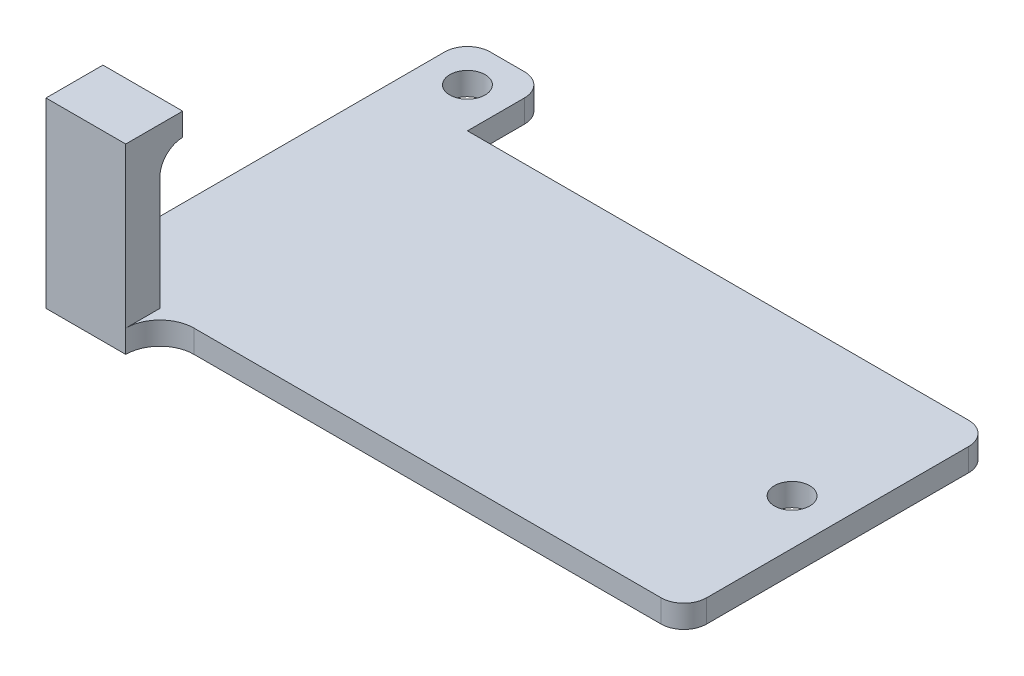
ISO-10303-21;
HEADER;
FILE_DESCRIPTION(('STEP AP214'),'2;1');
FILE_NAME('part.step','',(''),(''),'','','');
FILE_SCHEMA(('AUTOMOTIVE_DESIGN { 1 0 10303 214 1 1 1 1 }'));
ENDSEC;
DATA;
#1=APPLICATION_CONTEXT('core data for automotive mechanical design processes');
#2=APPLICATION_PROTOCOL_DEFINITION('international standard','automotive_design',2000,#1);
#3=PRODUCT_CONTEXT('',#1,'mechanical');
#4=PRODUCT('Part','Part','',(#3));
#5=PRODUCT_RELATED_PRODUCT_CATEGORY('part','',(#4));
#6=PRODUCT_DEFINITION_FORMATION('','',#4);
#7=PRODUCT_DEFINITION_CONTEXT('part definition',#1,'design');
#8=PRODUCT_DEFINITION('design','',#6,#7);
#9=PRODUCT_DEFINITION_SHAPE('','',#8);
#10=(LENGTH_UNIT() NAMED_UNIT(*) SI_UNIT(.MILLI.,.METRE.));
#11=(NAMED_UNIT(*) PLANE_ANGLE_UNIT() SI_UNIT($,.RADIAN.));
#12=(NAMED_UNIT(*) SI_UNIT($,.STERADIAN.) SOLID_ANGLE_UNIT());
#13=UNCERTAINTY_MEASURE_WITH_UNIT(LENGTH_MEASURE(1.E-05),#10,'distance_accuracy_value','');
#14=(GEOMETRIC_REPRESENTATION_CONTEXT(3) GLOBAL_UNCERTAINTY_ASSIGNED_CONTEXT((#13)) GLOBAL_UNIT_ASSIGNED_CONTEXT((#10,
#11,#12)) REPRESENTATION_CONTEXT('',''));
#15=CARTESIAN_POINT('',(0.,0.,0.));
#16=DIRECTION('',(0.,0.,1.));
#17=DIRECTION('',(1.,0.,0.));
#18=AXIS2_PLACEMENT_3D('',#15,#16,#17);
#19=CARTESIAN_POINT('',(-26.5,14.,13.5));
#20=DIRECTION('',(0.,0.,1.));
#21=DIRECTION('',(1.,0.,0.));
#22=AXIS2_PLACEMENT_3D('',#19,#20,#21);
#23=PLANE('',#22);
#24=DIRECTION('',(0.,-1.,0.));
#25=VECTOR('',#24,1.);
#26=CARTESIAN_POINT('',(-26.5,14.,13.5));
#27=LINE('',#26,#25);
#28=CARTESIAN_POINT('',(-26.5,10.,13.5));
#29=VERTEX_POINT('',#28);
#30=CARTESIAN_POINT('',(-26.5,0.,13.5));
#31=VERTEX_POINT('',#30);
#32=EDGE_CURVE('E201',#29,#31,#27,.T.);
#33=ORIENTED_EDGE('',*,*,#32,.F.);
#34=DIRECTION('',(-1.,0.,0.));
#35=VECTOR('',#34,1.);
#36=CARTESIAN_POINT('',(-19.5,10.,13.5));
#37=LINE('',#36,#35);
#38=CARTESIAN_POINT('',(-19.5,10.,13.5));
#39=VERTEX_POINT('',#38);
#40=EDGE_CURVE('E251',#29,#39,#37,.F.);
#41=ORIENTED_EDGE('',*,*,#40,.T.);
#42=DIRECTION('',(0.,-1.,0.));
#43=VECTOR('',#42,1.);
#44=CARTESIAN_POINT('',(-19.5,14.,13.5));
#45=LINE('',#44,#43);
#46=CARTESIAN_POINT('',(-19.5,0.,13.5));
#47=VERTEX_POINT('',#46);
#48=EDGE_CURVE('E167',#39,#47,#45,.T.);
#49=ORIENTED_EDGE('',*,*,#48,.T.);
#50=DIRECTION('',(-1.,0.,0.));
#51=VECTOR('',#50,1.);
#52=CARTESIAN_POINT('',(-26.5,0.,13.5));
#53=LINE('',#52,#51);
#54=EDGE_CURVE('E192',#47,#31,#53,.T.);
#55=ORIENTED_EDGE('',*,*,#54,.T.);
#56=EDGE_LOOP('',(#33,#41,#49,#55));
#57=FACE_BOUND('',#56,.T.);
#58=ADVANCED_FACE('F43',(#57),#23,.F.);
#59=CARTESIAN_POINT('',(-19.5,-2.,0.));
#60=DIRECTION('',(-1.,0.,0.));
#61=DIRECTION('',(0.,0.,1.));
#62=AXIS2_PLACEMENT_3D('',#59,#60,#61);
#63=PLANE('',#62);
#64=DIRECTION('',(0.,1.,0.));
#65=VECTOR('',#64,1.);
#66=CARTESIAN_POINT('',(-19.5,-2.,16.5));
#67=LINE('',#66,#65);
#68=CARTESIAN_POINT('',(-19.5,0.,16.5));
#69=VERTEX_POINT('',#68);
#70=CARTESIAN_POINT('',(-19.5,14.,16.5));
#71=VERTEX_POINT('',#70);
#72=EDGE_CURVE('E252',#69,#71,#67,.T.);
#73=ORIENTED_EDGE('',*,*,#72,.F.);
#74=DIRECTION('',(0.,0.,-1.));
#75=VECTOR('',#74,1.);
#76=CARTESIAN_POINT('',(-19.5,0.,0.));
#77=LINE('',#76,#75);
#78=EDGE_CURVE('E171',#69,#47,#77,.T.);
#79=ORIENTED_EDGE('',*,*,#78,.T.);
#80=ORIENTED_EDGE('',*,*,#48,.F.);
#81=CARTESIAN_POINT('',(-19.5,10.,11.5));
#82=DIRECTION('',(-1.,0.,0.));
#83=DIRECTION('',(0.,0.,1.));
#84=AXIS2_PLACEMENT_3D('',#81,#82,#83);
#85=CIRCLE('',#84,2.);
#86=CARTESIAN_POINT('',(-19.5,12.,11.5));
#87=VERTEX_POINT('',#86);
#88=EDGE_CURVE('E160',#39,#87,#85,.T.);
#89=ORIENTED_EDGE('',*,*,#88,.T.);
#90=DIRECTION('',(0.,-1.,0.));
#91=VECTOR('',#90,1.);
#92=CARTESIAN_POINT('',(-19.5,14.,11.5));
#93=LINE('',#92,#91);
#94=CARTESIAN_POINT('',(-19.5,14.,11.5));
#95=VERTEX_POINT('',#94);
#96=EDGE_CURVE('E165',#95,#87,#93,.T.);
#97=ORIENTED_EDGE('',*,*,#96,.F.);
#98=DIRECTION('',(0.,0.,-1.));
#99=VECTOR('',#98,1.);
#100=CARTESIAN_POINT('',(-19.5,14.,16.5));
#101=LINE('',#100,#99);
#102=EDGE_CURVE('E199',#71,#95,#101,.T.);
#103=ORIENTED_EDGE('',*,*,#102,.F.);
#104=EDGE_LOOP('',(#73,#79,#80,#89,#97,#103));
#105=FACE_BOUND('',#104,.T.);
#106=ADVANCED_FACE('F163',(#105),#63,.F.);
#107=CARTESIAN_POINT('',(0.,-2.,16.5));
#108=DIRECTION('',(0.,0.,1.));
#109=DIRECTION('',(1.,0.,0.));
#110=AXIS2_PLACEMENT_3D('',#107,#108,#109);
#111=PLANE('',#110);
#112=CARTESIAN_POINT('',(-19.5,-2.,16.5));
#113=VERTEX_POINT('',#112);
#114=EDGE_CURVE('E248',#113,#69,#67,.T.);
#115=ORIENTED_EDGE('',*,*,#114,.T.);
#116=ORIENTED_EDGE('',*,*,#72,.T.);
#117=DIRECTION('',(1.,0.,0.));
#118=VECTOR('',#117,1.);
#119=CARTESIAN_POINT('',(-26.5,14.,16.5));
#120=LINE('',#119,#118);
#121=CARTESIAN_POINT('',(-26.5,14.,16.5));
#122=VERTEX_POINT('',#121);
#123=EDGE_CURVE('E196',#122,#71,#120,.T.);
#124=ORIENTED_EDGE('',*,*,#123,.F.);
#125=DIRECTION('',(0.,1.,0.));
#126=VECTOR('',#125,1.);
#127=CARTESIAN_POINT('',(-26.5,-2.,16.5));
#128=LINE('',#127,#126);
#129=CARTESIAN_POINT('',(-26.5,-2.,16.5));
#130=VERTEX_POINT('',#129);
#131=EDGE_CURVE('E253',#130,#122,#128,.T.);
#132=ORIENTED_EDGE('',*,*,#131,.F.);
#133=DIRECTION('',(1.,0.,0.));
#134=VECTOR('',#133,1.);
#135=CARTESIAN_POINT('',(0.,-2.,16.5));
#136=LINE('',#135,#134);
#137=EDGE_CURVE('E224',#130,#113,#136,.T.);
#138=ORIENTED_EDGE('',*,*,#137,.T.);
#139=EDGE_LOOP('',(#115,#116,#124,#132,#138));
#140=FACE_BOUND('',#139,.T.);
#141=ADVANCED_FACE('F323',(#140),#111,.T.);
#142=CARTESIAN_POINT('',(-26.5,-2.,0.));
#143=DIRECTION('',(-1.,0.,0.));
#144=DIRECTION('',(0.,0.,1.));
#145=AXIS2_PLACEMENT_3D('',#142,#143,#144);
#146=PLANE('',#145);
#147=DIRECTION('',(0.,0.,1.));
#148=VECTOR('',#147,1.);
#149=CARTESIAN_POINT('',(-26.5,0.,0.));
#150=LINE('',#149,#148);
#151=CARTESIAN_POINT('',(-26.5,0.,-18.5));
#152=VERTEX_POINT('',#151);
#153=EDGE_CURVE('E244',#152,#31,#150,.T.);
#154=ORIENTED_EDGE('',*,*,#153,.F.);
#155=DIRECTION('',(0.,1.,0.));
#156=VECTOR('',#155,1.);
#157=CARTESIAN_POINT('',(-26.5,-2.,-18.5));
#158=LINE('',#157,#156);
#159=CARTESIAN_POINT('',(-26.5,-2.,-18.5));
#160=VERTEX_POINT('',#159);
#161=EDGE_CURVE('E278',#152,#160,#158,.F.);
#162=ORIENTED_EDGE('',*,*,#161,.T.);
#163=DIRECTION('',(0.,0.,1.));
#164=VECTOR('',#163,1.);
#165=CARTESIAN_POINT('',(-26.5,-2.,0.));
#166=LINE('',#165,#164);
#167=EDGE_CURVE('E222',#160,#130,#166,.T.);
#168=ORIENTED_EDGE('',*,*,#167,.T.);
#169=ORIENTED_EDGE('',*,*,#131,.T.);
#170=DIRECTION('',(0.,0.,1.));
#171=VECTOR('',#170,1.);
#172=CARTESIAN_POINT('',(-26.5,14.,16.5));
#173=LINE('',#172,#171);
#174=CARTESIAN_POINT('',(-26.5,14.,11.5));
#175=VERTEX_POINT('',#174);
#176=EDGE_CURVE('E193',#175,#122,#173,.T.);
#177=ORIENTED_EDGE('',*,*,#176,.F.);
#178=DIRECTION('',(0.,1.,0.));
#179=VECTOR('',#178,1.);
#180=CARTESIAN_POINT('',(-26.5,14.,11.5));
#181=LINE('',#180,#179);
#182=CARTESIAN_POINT('',(-26.5,12.,11.5));
#183=VERTEX_POINT('',#182);
#184=EDGE_CURVE('E186',#183,#175,#181,.T.);
#185=ORIENTED_EDGE('',*,*,#184,.F.);
#186=CARTESIAN_POINT('',(-26.5,10.,11.5));
#187=DIRECTION('',(-1.,0.,0.));
#188=DIRECTION('',(0.,0.,1.));
#189=AXIS2_PLACEMENT_3D('',#186,#187,#188);
#190=CIRCLE('',#189,2.);
#191=EDGE_CURVE('E172',#183,#29,#190,.F.);
#192=ORIENTED_EDGE('',*,*,#191,.T.);
#193=ORIENTED_EDGE('',*,*,#32,.T.);
#194=EDGE_LOOP('',(#154,#162,#168,#169,#177,#185,#192,#193));
#195=FACE_BOUND('',#194,.T.);
#196=ADVANCED_FACE('F383',(#195),#146,.T.);
#197=CARTESIAN_POINT('',(0.,-2.,-20.5));
#198=DIRECTION('',(0.,0.,1.));
#199=DIRECTION('',(1.,0.,0.));
#200=AXIS2_PLACEMENT_3D('',#197,#198,#199);
#201=PLANE('',#200);
#202=DIRECTION('',(1.,0.,0.));
#203=VECTOR('',#202,1.);
#204=CARTESIAN_POINT('',(0.,-2.,-20.5));
#205=LINE('',#204,#203);
#206=CARTESIAN_POINT('',(-24.5,-2.,-20.5));
#207=VERTEX_POINT('',#206);
#208=CARTESIAN_POINT('',(-21.5,-2.,-20.5));
#209=VERTEX_POINT('',#208);
#210=EDGE_CURVE('E219',#207,#209,#205,.T.);
#211=ORIENTED_EDGE('',*,*,#210,.F.);
#212=DIRECTION('',(0.,1.,0.));
#213=VECTOR('',#212,1.);
#214=CARTESIAN_POINT('',(-24.5,0.,-20.5));
#215=LINE('',#214,#213);
#216=CARTESIAN_POINT('',(-24.5,0.,-20.5));
#217=VERTEX_POINT('',#216);
#218=EDGE_CURVE('E267',#207,#217,#215,.T.);
#219=ORIENTED_EDGE('',*,*,#218,.T.);
#220=DIRECTION('',(1.,0.,0.));
#221=VECTOR('',#220,1.);
#222=CARTESIAN_POINT('',(0.,0.,-20.5));
#223=LINE('',#222,#221);
#224=CARTESIAN_POINT('',(-21.5,0.,-20.5));
#225=VERTEX_POINT('',#224);
#226=EDGE_CURVE('E241',#217,#225,#223,.T.);
#227=ORIENTED_EDGE('',*,*,#226,.T.);
#228=DIRECTION('',(0.,1.,0.));
#229=VECTOR('',#228,1.);
#230=CARTESIAN_POINT('',(-21.5,-2.,-20.5));
#231=LINE('',#230,#229);
#232=EDGE_CURVE('E265',#225,#209,#231,.F.);
#233=ORIENTED_EDGE('',*,*,#232,.T.);
#234=EDGE_LOOP('',(#211,#219,#227,#233));
#235=FACE_BOUND('',#234,.T.);
#236=ADVANCED_FACE('F334',(#235),#201,.F.);
#237=CARTESIAN_POINT('',(-19.5,-2.,0.));
#238=DIRECTION('',(1.,0.,0.));
#239=DIRECTION('',(0.,0.,-1.));
#240=AXIS2_PLACEMENT_3D('',#237,#238,#239);
#241=PLANE('',#240);
#242=DIRECTION('',(0.,0.,-1.));
#243=VECTOR('',#242,1.);
#244=CARTESIAN_POINT('',(-19.5,-2.,0.));
#245=LINE('',#244,#243);
#246=CARTESIAN_POINT('',(-19.5,-2.,-13.5));
#247=VERTEX_POINT('',#246);
#248=CARTESIAN_POINT('',(-19.5,-2.,-18.5));
#249=VERTEX_POINT('',#248);
#250=EDGE_CURVE('E216',#247,#249,#245,.T.);
#251=ORIENTED_EDGE('',*,*,#250,.T.);
#252=DIRECTION('',(0.,1.,0.));
#253=VECTOR('',#252,1.);
#254=CARTESIAN_POINT('',(-19.5,0.,-18.5));
#255=LINE('',#254,#253);
#256=CARTESIAN_POINT('',(-19.5,0.,-18.5));
#257=VERTEX_POINT('',#256);
#258=EDGE_CURVE('E287',#249,#257,#255,.T.);
#259=ORIENTED_EDGE('',*,*,#258,.T.);
#260=DIRECTION('',(0.,0.,-1.));
#261=VECTOR('',#260,1.);
#262=CARTESIAN_POINT('',(-19.5,0.,0.));
#263=LINE('',#262,#261);
#264=CARTESIAN_POINT('',(-19.5,0.,-13.5));
#265=VERTEX_POINT('',#264);
#266=EDGE_CURVE('E238',#265,#257,#263,.T.);
#267=ORIENTED_EDGE('',*,*,#266,.F.);
#268=DIRECTION('',(0.,1.,0.));
#269=VECTOR('',#268,1.);
#270=CARTESIAN_POINT('',(-19.5,-2.,-13.5));
#271=LINE('',#270,#269);
#272=EDGE_CURVE('E230',#247,#265,#271,.T.);
#273=ORIENTED_EDGE('',*,*,#272,.F.);
#274=EDGE_LOOP('',(#251,#259,#267,#273));
#275=FACE_BOUND('',#274,.T.);
#276=ADVANCED_FACE('F343',(#275),#241,.T.);
#277=CARTESIAN_POINT('',(0.,-2.,-13.5));
#278=DIRECTION('',(0.,0.,1.));
#279=DIRECTION('',(1.,0.,0.));
#280=AXIS2_PLACEMENT_3D('',#277,#278,#279);
#281=PLANE('',#280);
#282=DIRECTION('',(1.,0.,0.));
#283=VECTOR('',#282,1.);
#284=CARTESIAN_POINT('',(0.,0.,-13.5));
#285=LINE('',#284,#283);
#286=CARTESIAN_POINT('',(24.5,0.,-13.5));
#287=VERTEX_POINT('',#286);
#288=EDGE_CURVE('E235',#265,#287,#285,.T.);
#289=ORIENTED_EDGE('',*,*,#288,.T.);
#290=DIRECTION('',(0.,1.,0.));
#291=VECTOR('',#290,1.);
#292=CARTESIAN_POINT('',(24.5,-2.,-13.5));
#293=LINE('',#292,#291);
#294=CARTESIAN_POINT('',(24.5,-2.,-13.5));
#295=VERTEX_POINT('',#294);
#296=EDGE_CURVE('E11',#287,#295,#293,.F.);
#297=ORIENTED_EDGE('',*,*,#296,.T.);
#298=DIRECTION('',(1.,0.,0.));
#299=VECTOR('',#298,1.);
#300=CARTESIAN_POINT('',(0.,-2.,-13.5));
#301=LINE('',#300,#299);
#302=EDGE_CURVE('E214',#247,#295,#301,.T.);
#303=ORIENTED_EDGE('',*,*,#302,.F.);
#304=ORIENTED_EDGE('',*,*,#272,.T.);
#305=EDGE_LOOP('',(#289,#297,#303,#304));
#306=FACE_BOUND('',#305,.T.);
#307=ADVANCED_FACE('F348',(#306),#281,.F.);
#308=CARTESIAN_POINT('',(26.5,-2.,0.));
#309=DIRECTION('',(-1.,0.,0.));
#310=DIRECTION('',(0.,0.,1.));
#311=AXIS2_PLACEMENT_3D('',#308,#309,#310);
#312=PLANE('',#311);
#313=DIRECTION('',(0.,0.,1.));
#314=VECTOR('',#313,1.);
#315=CARTESIAN_POINT('',(26.5,0.,0.));
#316=LINE('',#315,#314);
#317=CARTESIAN_POINT('',(26.5,0.,-11.5));
#318=VERTEX_POINT('',#317);
#319=CARTESIAN_POINT('',(26.5,0.,11.5));
#320=VERTEX_POINT('',#319);
#321=EDGE_CURVE('E233',#318,#320,#316,.T.);
#322=ORIENTED_EDGE('',*,*,#321,.T.);
#323=DIRECTION('',(0.,1.,0.));
#324=VECTOR('',#323,1.);
#325=CARTESIAN_POINT('',(26.5,-2.,11.5));
#326=LINE('',#325,#324);
#327=CARTESIAN_POINT('',(26.5,-2.,11.5));
#328=VERTEX_POINT('',#327);
#329=EDGE_CURVE('E51',#320,#328,#326,.F.);
#330=ORIENTED_EDGE('',*,*,#329,.T.);
#331=DIRECTION('',(0.,0.,1.));
#332=VECTOR('',#331,1.);
#333=CARTESIAN_POINT('',(26.5,-2.,0.));
#334=LINE('',#333,#332);
#335=CARTESIAN_POINT('',(26.5,-2.,-11.5));
#336=VERTEX_POINT('',#335);
#337=EDGE_CURVE('E211',#336,#328,#334,.T.);
#338=ORIENTED_EDGE('',*,*,#337,.F.);
#339=DIRECTION('',(0.,1.,0.));
#340=VECTOR('',#339,1.);
#341=CARTESIAN_POINT('',(26.5,-2.,-11.5));
#342=LINE('',#341,#340);
#343=EDGE_CURVE('E293',#336,#318,#342,.T.);
#344=ORIENTED_EDGE('',*,*,#343,.T.);
#345=EDGE_LOOP('',(#322,#330,#338,#344));
#346=FACE_BOUND('',#345,.T.);
#347=ADVANCED_FACE('F297',(#346),#312,.F.);
#348=CARTESIAN_POINT('',(0.,-2.,13.5));
#349=DIRECTION('',(0.,0.,1.));
#350=DIRECTION('',(1.,0.,0.));
#351=AXIS2_PLACEMENT_3D('',#348,#349,#350);
#352=PLANE('',#351);
#353=DIRECTION('',(1.,0.,0.));
#354=VECTOR('',#353,1.);
#355=CARTESIAN_POINT('',(0.,-2.,13.5));
#356=LINE('',#355,#354);
#357=CARTESIAN_POINT('',(-16.5,-2.,13.5));
#358=VERTEX_POINT('',#357);
#359=CARTESIAN_POINT('',(24.5,-2.,13.5));
#360=VERTEX_POINT('',#359);
#361=EDGE_CURVE('E208',#358,#360,#356,.T.);
#362=ORIENTED_EDGE('',*,*,#361,.T.);
#363=DIRECTION('',(0.,1.,0.));
#364=VECTOR('',#363,1.);
#365=CARTESIAN_POINT('',(24.5,0.,13.5));
#366=LINE('',#365,#364);
#367=CARTESIAN_POINT('',(24.5,0.,13.5));
#368=VERTEX_POINT('',#367);
#369=EDGE_CURVE('E290',#360,#368,#366,.T.);
#370=ORIENTED_EDGE('',*,*,#369,.T.);
#371=DIRECTION('',(1.,0.,0.));
#372=VECTOR('',#371,1.);
#373=CARTESIAN_POINT('',(0.,0.,13.5));
#374=LINE('',#373,#372);
#375=CARTESIAN_POINT('',(-16.5,0.,13.5));
#376=VERTEX_POINT('',#375);
#377=EDGE_CURVE('E207',#376,#368,#374,.T.);
#378=ORIENTED_EDGE('',*,*,#377,.F.);
#379=DIRECTION('',(0.,1.,0.));
#380=VECTOR('',#379,1.);
#381=CARTESIAN_POINT('',(-16.5,-2.,13.5));
#382=LINE('',#381,#380);
#383=EDGE_CURVE('E259',#376,#358,#382,.F.);
#384=ORIENTED_EDGE('',*,*,#383,.T.);
#385=EDGE_LOOP('',(#362,#370,#378,#384));
#386=FACE_BOUND('',#385,.T.);
#387=ADVANCED_FACE('F310',(#386),#352,.T.);
#388=CARTESIAN_POINT('',(-23.,-2.,-17.));
#389=DIRECTION('',(0.,1.,0.));
#390=DIRECTION('',(0.,0.,1.));
#391=AXIS2_PLACEMENT_3D('',#388,#389,#390);
#392=CYLINDRICAL_SURFACE('',#391,1.55);
#393=CARTESIAN_POINT('',(-23.,-2.,-17.));
#394=DIRECTION('',(0.,1.,0.));
#395=DIRECTION('',(0.,0.,1.));
#396=AXIS2_PLACEMENT_3D('',#393,#394,#395);
#397=CIRCLE('',#396,1.55);
#398=CARTESIAN_POINT('',(-23.,-2.,-15.45));
#399=VERTEX_POINT('',#398);
#400=EDGE_CURVE('E227',#399,#399,#397,.T.);
#401=ORIENTED_EDGE('',*,*,#400,.F.);
#402=EDGE_LOOP('',(#401));
#403=FACE_BOUND('',#402,.T.);
#404=CARTESIAN_POINT('',(-23.,0.,-17.));
#405=DIRECTION('',(0.,1.,0.));
#406=DIRECTION('',(0.,0.,1.));
#407=AXIS2_PLACEMENT_3D('',#404,#405,#406);
#408=CIRCLE('',#407,1.55);
#409=CARTESIAN_POINT('',(-23.,0.,-15.45));
#410=VERTEX_POINT('',#409);
#411=EDGE_CURVE('E212',#410,#410,#408,.T.);
#412=ORIENTED_EDGE('',*,*,#411,.T.);
#413=EDGE_LOOP('',(#412));
#414=FACE_BOUND('',#413,.T.);
#415=ADVANCED_FACE('F373',(#403,#414),#392,.F.);
#416=CARTESIAN_POINT('',(0.,-2.,0.));
#417=DIRECTION('',(0.,1.,0.));
#418=DIRECTION('',(0.,0.,1.));
#419=AXIS2_PLACEMENT_3D('',#416,#417,#418);
#420=PLANE('',#419);
#421=CARTESIAN_POINT('',(22.5,-2.,0.));
#422=DIRECTION('',(0.,1.,0.));
#423=DIRECTION('',(0.,0.,1.));
#424=AXIS2_PLACEMENT_3D('',#421,#422,#423);
#425=CIRCLE('',#424,1.55);
#426=CARTESIAN_POINT('',(22.5,-2.,1.55));
#427=VERTEX_POINT('',#426);
#428=EDGE_CURVE('E183',#427,#427,#425,.T.);
#429=ORIENTED_EDGE('',*,*,#428,.T.);
#430=EDGE_LOOP('',(#429));
#431=FACE_BOUND('',#430,.T.);
#432=ORIENTED_EDGE('',*,*,#167,.F.);
#433=CARTESIAN_POINT('',(-24.5,-2.,-18.5));
#434=DIRECTION('',(0.,1.,0.));
#435=DIRECTION('',(0.,0.,1.));
#436=AXIS2_PLACEMENT_3D('',#433,#434,#435);
#437=CIRCLE('',#436,2.);
#438=EDGE_CURVE('E285',#160,#207,#437,.F.);
#439=ORIENTED_EDGE('',*,*,#438,.T.);
#440=ORIENTED_EDGE('',*,*,#210,.T.);
#441=CARTESIAN_POINT('',(-21.5,-2.,-18.5));
#442=DIRECTION('',(0.,1.,0.));
#443=DIRECTION('',(0.,0.,1.));
#444=AXIS2_PLACEMENT_3D('',#441,#442,#443);
#445=CIRCLE('',#444,2.);
#446=EDGE_CURVE('E283',#209,#249,#445,.F.);
#447=ORIENTED_EDGE('',*,*,#446,.T.);
#448=ORIENTED_EDGE('',*,*,#250,.F.);
#449=ORIENTED_EDGE('',*,*,#302,.T.);
#450=CARTESIAN_POINT('',(24.5,-2.,-11.5));
#451=DIRECTION('',(0.,1.,0.));
#452=DIRECTION('',(0.,0.,1.));
#453=AXIS2_PLACEMENT_3D('',#450,#451,#452);
#454=CIRCLE('',#453,2.);
#455=EDGE_CURVE('E64',#295,#336,#454,.F.);
#456=ORIENTED_EDGE('',*,*,#455,.T.);
#457=ORIENTED_EDGE('',*,*,#337,.T.);
#458=CARTESIAN_POINT('',(24.5,-2.,11.5));
#459=DIRECTION('',(0.,1.,0.));
#460=DIRECTION('',(0.,0.,1.));
#461=AXIS2_PLACEMENT_3D('',#458,#459,#460);
#462=CIRCLE('',#461,2.);
#463=EDGE_CURVE('E281',#328,#360,#462,.F.);
#464=ORIENTED_EDGE('',*,*,#463,.T.);
#465=ORIENTED_EDGE('',*,*,#361,.F.);
#466=CARTESIAN_POINT('',(-16.5,-2.,16.5));
#467=DIRECTION('',(0.,1.,0.));
#468=DIRECTION('',(0.,0.,1.));
#469=AXIS2_PLACEMENT_3D('',#466,#467,#468);
#470=CIRCLE('',#469,3.);
#471=EDGE_CURVE('E263',#358,#113,#470,.T.);
#472=ORIENTED_EDGE('',*,*,#471,.T.);
#473=ORIENTED_EDGE('',*,*,#137,.F.);
#474=EDGE_LOOP('',(#432,#439,#440,#447,#448,#449,#456,#457,#464,#465,#472,#473));
#475=FACE_BOUND('',#474,.T.);
#476=ORIENTED_EDGE('',*,*,#400,.T.);
#477=EDGE_LOOP('',(#476));
#478=FACE_BOUND('',#477,.T.);
#479=ADVANCED_FACE('F315',(#431,#475,#478),#420,.F.);
#480=CARTESIAN_POINT('',(0.,0.,0.));
#481=DIRECTION('',(0.,1.,0.));
#482=DIRECTION('',(0.,0.,1.));
#483=AXIS2_PLACEMENT_3D('',#480,#481,#482);
#484=PLANE('',#483);
#485=CARTESIAN_POINT('',(22.5,0.,0.));
#486=DIRECTION('',(0.,1.,0.));
#487=DIRECTION('',(0.,0.,1.));
#488=AXIS2_PLACEMENT_3D('',#485,#486,#487);
#489=CIRCLE('',#488,1.55);
#490=CARTESIAN_POINT('',(22.5,0.,1.55));
#491=VERTEX_POINT('',#490);
#492=EDGE_CURVE('E560',#491,#491,#489,.T.);
#493=ORIENTED_EDGE('',*,*,#492,.F.);
#494=EDGE_LOOP('',(#493));
#495=FACE_BOUND('',#494,.T.);
#496=ORIENTED_EDGE('',*,*,#226,.F.);
#497=CARTESIAN_POINT('',(-24.5,0.,-18.5));
#498=DIRECTION('',(0.,1.,0.));
#499=DIRECTION('',(0.,0.,1.));
#500=AXIS2_PLACEMENT_3D('',#497,#498,#499);
#501=CIRCLE('',#500,2.);
#502=EDGE_CURVE('E276',#217,#152,#501,.T.);
#503=ORIENTED_EDGE('',*,*,#502,.T.);
#504=ORIENTED_EDGE('',*,*,#153,.T.);
#505=ORIENTED_EDGE('',*,*,#54,.F.);
#506=ORIENTED_EDGE('',*,*,#78,.F.);
#507=CARTESIAN_POINT('',(-16.5,0.,16.5));
#508=DIRECTION('',(0.,1.,0.));
#509=DIRECTION('',(0.,0.,1.));
#510=AXIS2_PLACEMENT_3D('',#507,#508,#509);
#511=CIRCLE('',#510,3.);
#512=EDGE_CURVE('E261',#69,#376,#511,.F.);
#513=ORIENTED_EDGE('',*,*,#512,.T.);
#514=ORIENTED_EDGE('',*,*,#377,.T.);
#515=CARTESIAN_POINT('',(24.5,0.,11.5));
#516=DIRECTION('',(0.,1.,0.));
#517=DIRECTION('',(0.,0.,1.));
#518=AXIS2_PLACEMENT_3D('',#515,#516,#517);
#519=CIRCLE('',#518,2.);
#520=EDGE_CURVE('E272',#368,#320,#519,.T.);
#521=ORIENTED_EDGE('',*,*,#520,.T.);
#522=ORIENTED_EDGE('',*,*,#321,.F.);
#523=CARTESIAN_POINT('',(24.5,0.,-11.5));
#524=DIRECTION('',(0.,1.,0.));
#525=DIRECTION('',(0.,0.,1.));
#526=AXIS2_PLACEMENT_3D('',#523,#524,#525);
#527=CIRCLE('',#526,2.);
#528=EDGE_CURVE('E270',#318,#287,#527,.T.);
#529=ORIENTED_EDGE('',*,*,#528,.T.);
#530=ORIENTED_EDGE('',*,*,#288,.F.);
#531=ORIENTED_EDGE('',*,*,#266,.T.);
#532=CARTESIAN_POINT('',(-21.5,0.,-18.5));
#533=DIRECTION('',(0.,1.,0.));
#534=DIRECTION('',(0.,0.,1.));
#535=AXIS2_PLACEMENT_3D('',#532,#533,#534);
#536=CIRCLE('',#535,2.);
#537=EDGE_CURVE('E274',#257,#225,#536,.T.);
#538=ORIENTED_EDGE('',*,*,#537,.T.);
#539=EDGE_LOOP('',(#496,#503,#504,#505,#506,#513,#514,#521,#522,#529,#530,#531,#538));
#540=FACE_BOUND('',#539,.T.);
#541=ORIENTED_EDGE('',*,*,#411,.F.);
#542=EDGE_LOOP('',(#541));
#543=FACE_BOUND('',#542,.T.);
#544=ADVANCED_FACE('F301',(#495,#540,#543),#484,.T.);
#545=CARTESIAN_POINT('',(0.,14.,0.));
#546=DIRECTION('',(0.,-1.,0.));
#547=DIRECTION('',(0.,0.,-1.));
#548=AXIS2_PLACEMENT_3D('',#545,#546,#547);
#549=PLANE('',#548);
#550=ORIENTED_EDGE('',*,*,#176,.T.);
#551=ORIENTED_EDGE('',*,*,#123,.T.);
#552=ORIENTED_EDGE('',*,*,#102,.T.);
#553=DIRECTION('',(1.,0.,0.));
#554=VECTOR('',#553,1.);
#555=CARTESIAN_POINT('',(-19.5,14.,11.5));
#556=LINE('',#555,#554);
#557=EDGE_CURVE('E182',#175,#95,#556,.T.);
#558=ORIENTED_EDGE('',*,*,#557,.F.);
#559=EDGE_LOOP('',(#550,#551,#552,#558));
#560=FACE_BOUND('',#559,.T.);
#561=ADVANCED_FACE('F369',(#560),#549,.F.);
#562=CARTESIAN_POINT('',(0.,0.,11.5));
#563=DIRECTION('',(0.,0.,-1.));
#564=DIRECTION('',(-1.,0.,0.));
#565=AXIS2_PLACEMENT_3D('',#562,#563,#564);
#566=PLANE('',#565);
#567=ORIENTED_EDGE('',*,*,#96,.T.);
#568=DIRECTION('',(-1.,0.,0.));
#569=VECTOR('',#568,1.);
#570=CARTESIAN_POINT('',(-19.5,12.,11.5));
#571=LINE('',#570,#569);
#572=EDGE_CURVE('E179',#87,#183,#571,.T.);
#573=ORIENTED_EDGE('',*,*,#572,.T.);
#574=ORIENTED_EDGE('',*,*,#184,.T.);
#575=ORIENTED_EDGE('',*,*,#557,.T.);
#576=EDGE_LOOP('',(#567,#573,#574,#575));
#577=FACE_BOUND('',#576,.T.);
#578=ADVANCED_FACE('F177',(#577),#566,.T.);
#579=CARTESIAN_POINT('',(-19.5,10.,11.5));
#580=DIRECTION('',(1.,0.,0.));
#581=DIRECTION('',(0.,0.,-1.));
#582=AXIS2_PLACEMENT_3D('',#579,#580,#581);
#583=CYLINDRICAL_SURFACE('',#582,2.);
#584=ORIENTED_EDGE('',*,*,#88,.F.);
#585=ORIENTED_EDGE('',*,*,#40,.F.);
#586=ORIENTED_EDGE('',*,*,#191,.F.);
#587=ORIENTED_EDGE('',*,*,#572,.F.);
#588=EDGE_LOOP('',(#584,#585,#586,#587));
#589=FACE_BOUND('',#588,.T.);
#590=ADVANCED_FACE('F185',(#589),#583,.F.);
#591=CARTESIAN_POINT('',(-16.5,-2.,16.5));
#592=DIRECTION('',(0.,1.,0.));
#593=DIRECTION('',(0.,0.,1.));
#594=AXIS2_PLACEMENT_3D('',#591,#592,#593);
#595=CYLINDRICAL_SURFACE('',#594,3.);
#596=ORIENTED_EDGE('',*,*,#471,.F.);
#597=ORIENTED_EDGE('',*,*,#383,.F.);
#598=ORIENTED_EDGE('',*,*,#512,.F.);
#599=ORIENTED_EDGE('',*,*,#114,.F.);
#600=EDGE_LOOP('',(#596,#597,#598,#599));
#601=FACE_BOUND('',#600,.T.);
#602=ADVANCED_FACE('F320',(#601),#595,.F.);
#603=CARTESIAN_POINT('',(22.5,-2.,0.));
#604=DIRECTION('',(0.,1.,0.));
#605=DIRECTION('',(0.,0.,1.));
#606=AXIS2_PLACEMENT_3D('',#603,#604,#605);
#607=CYLINDRICAL_SURFACE('',#606,1.55);
#608=ORIENTED_EDGE('',*,*,#428,.F.);
#609=EDGE_LOOP('',(#608));
#610=FACE_BOUND('',#609,.T.);
#611=ORIENTED_EDGE('',*,*,#492,.T.);
#612=EDGE_LOOP('',(#611));
#613=FACE_BOUND('',#612,.T.);
#614=ADVANCED_FACE('F514',(#610,#613),#607,.F.);
#615=CARTESIAN_POINT('',(-24.5,-2.,-18.5));
#616=DIRECTION('',(0.,-1.,0.));
#617=DIRECTION('',(0.,0.,-1.));
#618=AXIS2_PLACEMENT_3D('',#615,#616,#617);
#619=CYLINDRICAL_SURFACE('',#618,2.);
#620=ORIENTED_EDGE('',*,*,#438,.F.);
#621=ORIENTED_EDGE('',*,*,#161,.F.);
#622=ORIENTED_EDGE('',*,*,#502,.F.);
#623=ORIENTED_EDGE('',*,*,#218,.F.);
#624=EDGE_LOOP('',(#620,#621,#622,#623));
#625=FACE_BOUND('',#624,.T.);
#626=ADVANCED_FACE('F332',(#625),#619,.T.);
#627=CARTESIAN_POINT('',(-21.5,-2.,-18.5));
#628=DIRECTION('',(0.,-1.,0.));
#629=DIRECTION('',(0.,0.,-1.));
#630=AXIS2_PLACEMENT_3D('',#627,#628,#629);
#631=CYLINDRICAL_SURFACE('',#630,2.);
#632=ORIENTED_EDGE('',*,*,#446,.F.);
#633=ORIENTED_EDGE('',*,*,#232,.F.);
#634=ORIENTED_EDGE('',*,*,#537,.F.);
#635=ORIENTED_EDGE('',*,*,#258,.F.);
#636=EDGE_LOOP('',(#632,#633,#634,#635));
#637=FACE_BOUND('',#636,.T.);
#638=ADVANCED_FACE('F341',(#637),#631,.T.);
#639=CARTESIAN_POINT('',(24.5,-2.,11.5));
#640=DIRECTION('',(0.,-1.,0.));
#641=DIRECTION('',(0.,0.,-1.));
#642=AXIS2_PLACEMENT_3D('',#639,#640,#641);
#643=CYLINDRICAL_SURFACE('',#642,2.);
#644=ORIENTED_EDGE('',*,*,#463,.F.);
#645=ORIENTED_EDGE('',*,*,#329,.F.);
#646=ORIENTED_EDGE('',*,*,#520,.F.);
#647=ORIENTED_EDGE('',*,*,#369,.F.);
#648=EDGE_LOOP('',(#644,#645,#646,#647));
#649=FACE_BOUND('',#648,.T.);
#650=ADVANCED_FACE('F308',(#649),#643,.T.);
#651=CARTESIAN_POINT('',(24.5,-2.,-11.5));
#652=DIRECTION('',(0.,1.,0.));
#653=DIRECTION('',(0.,0.,1.));
#654=AXIS2_PLACEMENT_3D('',#651,#652,#653);
#655=CYLINDRICAL_SURFACE('',#654,2.);
#656=ORIENTED_EDGE('',*,*,#455,.F.);
#657=ORIENTED_EDGE('',*,*,#296,.F.);
#658=ORIENTED_EDGE('',*,*,#528,.F.);
#659=ORIENTED_EDGE('',*,*,#343,.F.);
#660=EDGE_LOOP('',(#656,#657,#658,#659));
#661=FACE_BOUND('',#660,.T.);
#662=ADVANCED_FACE('F45',(#661),#655,.T.);
#663=CLOSED_SHELL('',(#58,#106,#141,#196,#236,#276,#307,#347,#387,#415,#479,#544,#561,#578,#590,
#602,#614,#626,#638,#650,#662));
#664=MANIFOLD_SOLID_BREP('B2',#663);
#665=ADVANCED_BREP_SHAPE_REPRESENTATION('',(#18,#664),#14);
#666=SHAPE_DEFINITION_REPRESENTATION(#9,#665);
ENDSEC;
END-ISO-10303-21;
